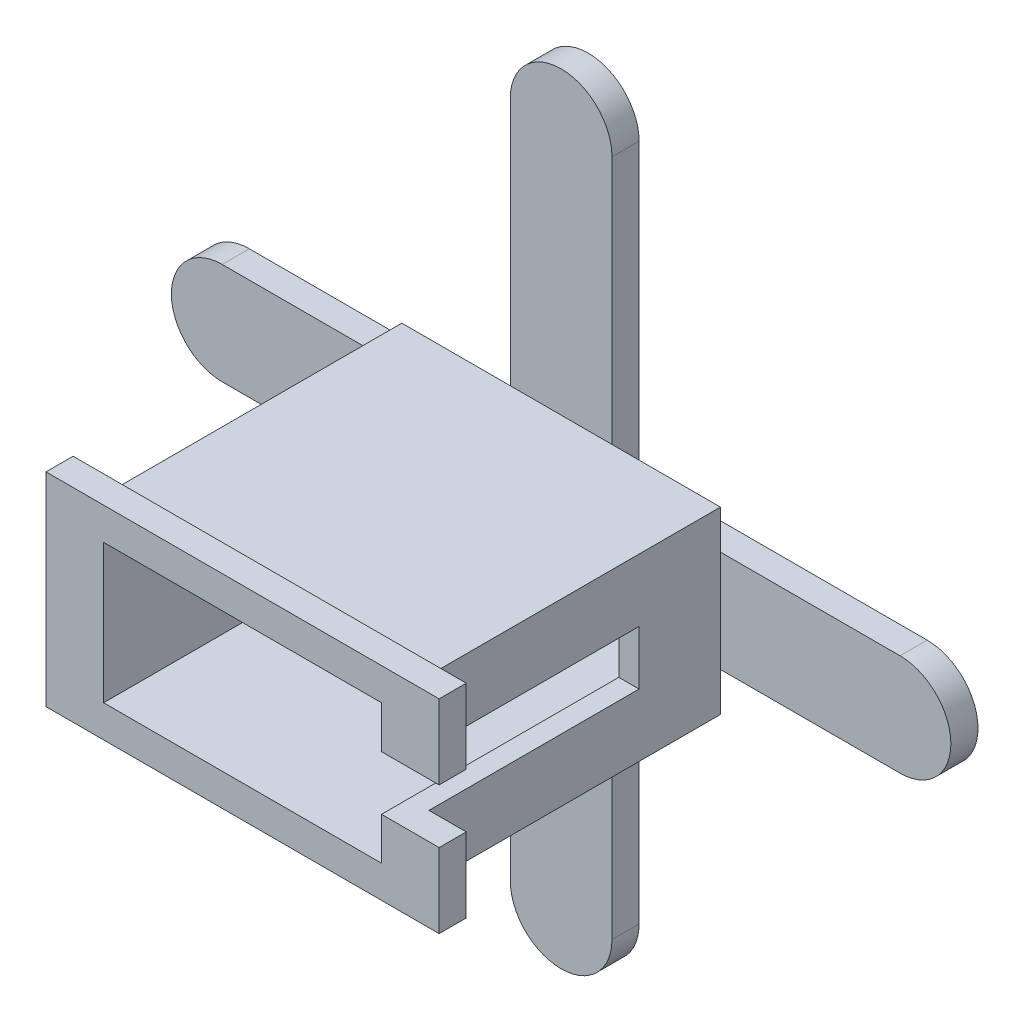
ISO-10303-21;
HEADER;
FILE_DESCRIPTION(('STEP AP214'),'2;1');
FILE_NAME('part.step','',(''),(''),'','','');
FILE_SCHEMA(('AUTOMOTIVE_DESIGN { 1 0 10303 214 1 1 1 1 }'));
ENDSEC;
DATA;
#1=APPLICATION_CONTEXT('core data for automotive mechanical design processes');
#2=APPLICATION_PROTOCOL_DEFINITION('international standard','automotive_design',2000,#1);
#3=PRODUCT_CONTEXT('',#1,'mechanical');
#4=PRODUCT('Part','Part','',(#3));
#5=PRODUCT_RELATED_PRODUCT_CATEGORY('part','',(#4));
#6=PRODUCT_DEFINITION_FORMATION('','',#4);
#7=PRODUCT_DEFINITION_CONTEXT('part definition',#1,'design');
#8=PRODUCT_DEFINITION('design','',#6,#7);
#9=PRODUCT_DEFINITION_SHAPE('','',#8);
#10=(LENGTH_UNIT() NAMED_UNIT(*) SI_UNIT(.MILLI.,.METRE.));
#11=(NAMED_UNIT(*) PLANE_ANGLE_UNIT() SI_UNIT($,.RADIAN.));
#12=(NAMED_UNIT(*) SI_UNIT($,.STERADIAN.) SOLID_ANGLE_UNIT());
#13=UNCERTAINTY_MEASURE_WITH_UNIT(LENGTH_MEASURE(1.E-05),#10,'distance_accuracy_value','');
#14=(GEOMETRIC_REPRESENTATION_CONTEXT(3) GLOBAL_UNCERTAINTY_ASSIGNED_CONTEXT((#13)) GLOBAL_UNIT_ASSIGNED_CONTEXT((#10,
#11,#12)) REPRESENTATION_CONTEXT('',''));
#15=CARTESIAN_POINT('',(0.,0.,0.));
#16=DIRECTION('',(0.,0.,1.));
#17=DIRECTION('',(1.,0.,0.));
#18=AXIS2_PLACEMENT_3D('',#15,#16,#17);
#19=CARTESIAN_POINT('',(29.,-15.,51.));
#20=DIRECTION('',(-1.,0.,0.));
#21=DIRECTION('',(0.,0.,1.));
#22=AXIS2_PLACEMENT_3D('',#19,#20,#21);
#23=PLANE('',#22);
#24=DIRECTION('',(0.,1.,0.));
#25=VECTOR('',#24,1.);
#26=CARTESIAN_POINT('',(29.,-15.,47.));
#27=LINE('',#26,#25);
#28=CARTESIAN_POINT('',(29.,-15.,47.));
#29=VERTEX_POINT('',#28);
#30=CARTESIAN_POINT('',(29.,-4.,47.));
#31=VERTEX_POINT('',#30);
#32=EDGE_CURVE('E320',#29,#31,#27,.T.);
#33=ORIENTED_EDGE('',*,*,#32,.T.);
#34=DIRECTION('',(0.,0.,1.));
#35=VECTOR('',#34,1.);
#36=CARTESIAN_POINT('',(29.,-4.,51.));
#37=LINE('',#36,#35);
#38=CARTESIAN_POINT('',(29.,-4.,51.));
#39=VERTEX_POINT('',#38);
#40=EDGE_CURVE('E47',#31,#39,#37,.T.);
#41=ORIENTED_EDGE('',*,*,#40,.T.);
#42=DIRECTION('',(0.,1.,0.));
#43=VECTOR('',#42,1.);
#44=CARTESIAN_POINT('',(29.,-15.,51.));
#45=LINE('',#44,#43);
#46=CARTESIAN_POINT('',(29.,-15.,51.));
#47=VERTEX_POINT('',#46);
#48=EDGE_CURVE('E304',#47,#39,#45,.T.);
#49=ORIENTED_EDGE('',*,*,#48,.F.);
#50=DIRECTION('',(0.,0.,-1.));
#51=VECTOR('',#50,1.);
#52=CARTESIAN_POINT('',(29.,-15.,51.));
#53=LINE('',#52,#51);
#54=EDGE_CURVE('E319',#47,#29,#53,.T.);
#55=ORIENTED_EDGE('',*,*,#54,.T.);
#56=EDGE_LOOP('',(#33,#41,#49,#55));
#57=FACE_BOUND('',#56,.T.);
#58=ADVANCED_FACE('F39',(#57),#23,.F.);
#59=CARTESIAN_POINT('',(0.,-49.9999999999997,4.));
#60=DIRECTION('',(0.,0.,1.));
#61=DIRECTION('',(1.,0.,0.));
#62=AXIS2_PLACEMENT_3D('',#59,#60,#61);
#63=PLANE('',#62);
#64=DIRECTION('',(0.,-1.,0.));
#65=VECTOR('',#64,1.);
#66=CARTESIAN_POINT('',(-7.5,-7.5,4.));
#67=LINE('',#66,#65);
#68=CARTESIAN_POINT('',(-7.5,-7.5,4.));
#69=VERTEX_POINT('',#68);
#70=CARTESIAN_POINT('',(-7.5,-10.25,4.));
#71=VERTEX_POINT('',#70);
#72=EDGE_CURVE('E457',#69,#71,#67,.T.);
#73=ORIENTED_EDGE('',*,*,#72,.T.);
#74=DIRECTION('',(1.,0.,0.));
#75=VECTOR('',#74,1.);
#76=CARTESIAN_POINT('',(-20.5,-10.25,4.));
#77=LINE('',#76,#75);
#78=CARTESIAN_POINT('',(7.5,-10.25,4.));
#79=VERTEX_POINT('',#78);
#80=EDGE_CURVE('E355',#71,#79,#77,.T.);
#81=ORIENTED_EDGE('',*,*,#80,.T.);
#82=DIRECTION('',(0.,1.,0.));
#83=VECTOR('',#82,1.);
#84=CARTESIAN_POINT('',(7.5,-7.49999999999999,4.));
#85=LINE('',#84,#83);
#86=CARTESIAN_POINT('',(7.5,-7.49999999999999,4.));
#87=VERTEX_POINT('',#86);
#88=EDGE_CURVE('E414',#79,#87,#85,.T.);
#89=ORIENTED_EDGE('',*,*,#88,.T.);
#90=DIRECTION('',(1.,0.,0.));
#91=VECTOR('',#90,1.);
#92=CARTESIAN_POINT('',(7.5,-7.49999999999999,4.));
#93=LINE('',#92,#91);
#94=CARTESIAN_POINT('',(20.5,-7.5,4.));
#95=VERTEX_POINT('',#94);
#96=EDGE_CURVE('E421',#87,#95,#93,.T.);
#97=ORIENTED_EDGE('',*,*,#96,.T.);
#98=DIRECTION('',(0.,1.,0.));
#99=VECTOR('',#98,1.);
#100=CARTESIAN_POINT('',(20.5,10.25,4.));
#101=LINE('',#100,#99);
#102=CARTESIAN_POINT('',(20.5,7.50000000000001,4.));
#103=VERTEX_POINT('',#102);
#104=EDGE_CURVE('E341',#95,#103,#101,.T.);
#105=ORIENTED_EDGE('',*,*,#104,.T.);
#106=DIRECTION('',(-1.,0.,0.));
#107=VECTOR('',#106,1.);
#108=CARTESIAN_POINT('',(7.5,7.50000000000001,4.));
#109=LINE('',#108,#107);
#110=CARTESIAN_POINT('',(7.5,7.50000000000001,4.));
#111=VERTEX_POINT('',#110);
#112=EDGE_CURVE('E427',#103,#111,#109,.T.);
#113=ORIENTED_EDGE('',*,*,#112,.T.);
#114=DIRECTION('',(0.,1.,0.));
#115=VECTOR('',#114,1.);
#116=CARTESIAN_POINT('',(7.49999999999999,50.,4.));
#117=LINE('',#116,#115);
#118=CARTESIAN_POINT('',(7.5,10.25,4.));
#119=VERTEX_POINT('',#118);
#120=EDGE_CURVE('E433',#111,#119,#117,.T.);
#121=ORIENTED_EDGE('',*,*,#120,.T.);
#122=DIRECTION('',(-1.,0.,0.));
#123=VECTOR('',#122,1.);
#124=CARTESIAN_POINT('',(-20.5,10.25,4.));
#125=LINE('',#124,#123);
#126=CARTESIAN_POINT('',(-7.5,10.25,4.));
#127=VERTEX_POINT('',#126);
#128=EDGE_CURVE('E345',#119,#127,#125,.T.);
#129=ORIENTED_EDGE('',*,*,#128,.T.);
#130=DIRECTION('',(0.,-1.,0.));
#131=VECTOR('',#130,1.);
#132=CARTESIAN_POINT('',(-7.50000000000001,50.,4.));
#133=LINE('',#132,#131);
#134=CARTESIAN_POINT('',(-7.5,7.50000000000001,4.));
#135=VERTEX_POINT('',#134);
#136=EDGE_CURVE('E439',#127,#135,#133,.T.);
#137=ORIENTED_EDGE('',*,*,#136,.T.);
#138=DIRECTION('',(-1.,0.,0.));
#139=VECTOR('',#138,1.);
#140=CARTESIAN_POINT('',(-50.,7.5,4.));
#141=LINE('',#140,#139);
#142=CARTESIAN_POINT('',(-20.5,7.50000000000001,4.));
#143=VERTEX_POINT('',#142);
#144=EDGE_CURVE('E445',#135,#143,#141,.T.);
#145=ORIENTED_EDGE('',*,*,#144,.T.);
#146=DIRECTION('',(0.,-1.,0.));
#147=VECTOR('',#146,1.);
#148=CARTESIAN_POINT('',(-20.5,10.25,4.));
#149=LINE('',#148,#147);
#150=CARTESIAN_POINT('',(-20.5,-7.5,4.));
#151=VERTEX_POINT('',#150);
#152=EDGE_CURVE('E350',#143,#151,#149,.T.);
#153=ORIENTED_EDGE('',*,*,#152,.T.);
#154=DIRECTION('',(1.,0.,0.));
#155=VECTOR('',#154,1.);
#156=CARTESIAN_POINT('',(-50.,-7.5,4.));
#157=LINE('',#156,#155);
#158=EDGE_CURVE('E451',#151,#69,#157,.T.);
#159=ORIENTED_EDGE('',*,*,#158,.T.);
#160=EDGE_LOOP('',(#73,#81,#89,#97,#105,#113,#121,#129,#137,#145,#153,#159));
#161=FACE_BOUND('',#160,.T.);
#162=ADVANCED_FACE('F584',(#161),#63,.T.);
#163=DIRECTION('',(1.,0.,0.));
#164=VECTOR('',#163,1.);
#165=CARTESIAN_POINT('',(-23.5,-13.25,4.));
#166=LINE('',#165,#164);
#167=CARTESIAN_POINT('',(-7.5,-13.25,4.));
#168=VERTEX_POINT('',#167);
#169=CARTESIAN_POINT('',(7.5,-13.25,4.));
#170=VERTEX_POINT('',#169);
#171=EDGE_CURVE('E398',#168,#170,#166,.T.);
#172=ORIENTED_EDGE('',*,*,#171,.F.);
#173=CARTESIAN_POINT('',(-7.49999999999999,-50.,4.));
#174=VERTEX_POINT('',#173);
#175=EDGE_CURVE('E455',#168,#174,#67,.T.);
#176=ORIENTED_EDGE('',*,*,#175,.T.);
#177=CARTESIAN_POINT('',(0.,-49.9999999999997,4.));
#178=DIRECTION('',(0.,0.,1.));
#179=DIRECTION('',(1.,0.,0.));
#180=AXIS2_PLACEMENT_3D('',#177,#178,#179);
#181=CIRCLE('',#180,7.5);
#182=CARTESIAN_POINT('',(7.50000000000001,-50.,4.));
#183=VERTEX_POINT('',#182);
#184=EDGE_CURVE('E411',#174,#183,#181,.T.);
#185=ORIENTED_EDGE('',*,*,#184,.T.);
#186=EDGE_CURVE('E416',#183,#170,#85,.T.);
#187=ORIENTED_EDGE('',*,*,#186,.T.);
#188=EDGE_LOOP('',(#172,#176,#185,#187));
#189=FACE_BOUND('',#188,.T.);
#190=ADVANCED_FACE('F639',(#189),#63,.T.);
#191=DIRECTION('',(0.,1.,0.));
#192=VECTOR('',#191,1.);
#193=CARTESIAN_POINT('',(23.5,-13.25,4.));
#194=LINE('',#193,#192);
#195=CARTESIAN_POINT('',(23.5,-7.49999999999999,4.));
#196=VERTEX_POINT('',#195);
#197=CARTESIAN_POINT('',(23.5,7.5,4.));
#198=VERTEX_POINT('',#197);
#199=EDGE_CURVE('E288',#196,#198,#194,.T.);
#200=ORIENTED_EDGE('',*,*,#199,.F.);
#201=CARTESIAN_POINT('',(50.,-7.5,4.));
#202=VERTEX_POINT('',#201);
#203=EDGE_CURVE('E419',#196,#202,#93,.T.);
#204=ORIENTED_EDGE('',*,*,#203,.T.);
#205=CARTESIAN_POINT('',(50.,0.,4.));
#206=DIRECTION('',(0.,0.,1.));
#207=DIRECTION('',(-1.,0.,0.));
#208=AXIS2_PLACEMENT_3D('',#205,#206,#207);
#209=CIRCLE('',#208,7.5);
#210=CARTESIAN_POINT('',(50.,7.5,4.));
#211=VERTEX_POINT('',#210);
#212=EDGE_CURVE('E424',#202,#211,#209,.T.);
#213=ORIENTED_EDGE('',*,*,#212,.T.);
#214=EDGE_CURVE('E428',#211,#198,#109,.T.);
#215=ORIENTED_EDGE('',*,*,#214,.T.);
#216=EDGE_LOOP('',(#200,#204,#213,#215));
#217=FACE_BOUND('',#216,.T.);
#218=ADVANCED_FACE('F698',(#217),#63,.T.);
#219=DIRECTION('',(-1.,0.,0.));
#220=VECTOR('',#219,1.);
#221=CARTESIAN_POINT('',(-23.5,13.25,4.));
#222=LINE('',#221,#220);
#223=CARTESIAN_POINT('',(7.5,13.25,4.));
#224=VERTEX_POINT('',#223);
#225=CARTESIAN_POINT('',(-7.5,13.25,4.));
#226=VERTEX_POINT('',#225);
#227=EDGE_CURVE('E389',#224,#226,#222,.T.);
#228=ORIENTED_EDGE('',*,*,#227,.F.);
#229=CARTESIAN_POINT('',(7.49999999999999,50.,4.));
#230=VERTEX_POINT('',#229);
#231=EDGE_CURVE('E431',#224,#230,#117,.T.);
#232=ORIENTED_EDGE('',*,*,#231,.T.);
#233=CARTESIAN_POINT('',(0.,50.,4.));
#234=DIRECTION('',(0.,0.,1.));
#235=DIRECTION('',(-1.,0.,0.));
#236=AXIS2_PLACEMENT_3D('',#233,#234,#235);
#237=CIRCLE('',#236,7.5);
#238=CARTESIAN_POINT('',(-7.50000000000001,50.,4.));
#239=VERTEX_POINT('',#238);
#240=EDGE_CURVE('E436',#230,#239,#237,.T.);
#241=ORIENTED_EDGE('',*,*,#240,.T.);
#242=EDGE_CURVE('E440',#239,#226,#133,.T.);
#243=ORIENTED_EDGE('',*,*,#242,.T.);
#244=EDGE_LOOP('',(#228,#232,#241,#243));
#245=FACE_BOUND('',#244,.T.);
#246=ADVANCED_FACE('F661',(#245),#63,.T.);
#247=CARTESIAN_POINT('',(0.,-49.9999999999997,4.));
#248=DIRECTION('',(0.,0.,-1.));
#249=DIRECTION('',(-1.,0.,0.));
#250=AXIS2_PLACEMENT_3D('',#247,#248,#249);
#251=CYLINDRICAL_SURFACE('',#250,7.5);
#252=CARTESIAN_POINT('',(0.,-49.9999999999997,0.));
#253=DIRECTION('',(0.,0.,1.));
#254=DIRECTION('',(1.,0.,0.));
#255=AXIS2_PLACEMENT_3D('',#252,#253,#254);
#256=CIRCLE('',#255,7.5);
#257=CARTESIAN_POINT('',(-7.49999999999999,-50.,0.));
#258=VERTEX_POINT('',#257);
#259=CARTESIAN_POINT('',(7.50000000000001,-50.,0.));
#260=VERTEX_POINT('',#259);
#261=EDGE_CURVE('E410',#258,#260,#256,.T.);
#262=ORIENTED_EDGE('',*,*,#261,.T.);
#263=DIRECTION('',(0.,0.,-1.));
#264=VECTOR('',#263,1.);
#265=CARTESIAN_POINT('',(7.50000000000001,-50.,4.));
#266=LINE('',#265,#264);
#267=EDGE_CURVE('E517',#183,#260,#266,.T.);
#268=ORIENTED_EDGE('',*,*,#267,.F.);
#269=ORIENTED_EDGE('',*,*,#184,.F.);
#270=DIRECTION('',(0.,0.,-1.));
#271=VECTOR('',#270,1.);
#272=CARTESIAN_POINT('',(-7.49999999999999,-50.,4.));
#273=LINE('',#272,#271);
#274=EDGE_CURVE('E460',#174,#258,#273,.T.);
#275=ORIENTED_EDGE('',*,*,#274,.T.);
#276=EDGE_LOOP('',(#262,#268,#269,#275));
#277=FACE_BOUND('',#276,.T.);
#278=ADVANCED_FACE('F41',(#277),#251,.T.);
#279=CARTESIAN_POINT('',(7.5,-7.49999999999999,4.));
#280=DIRECTION('',(-1.,0.,0.));
#281=DIRECTION('',(0.,-1.,0.));
#282=AXIS2_PLACEMENT_3D('',#279,#280,#281);
#283=PLANE('',#282);
#284=DIRECTION('',(0.,1.,0.));
#285=VECTOR('',#284,1.);
#286=CARTESIAN_POINT('',(7.5,-7.49999999999999,0.));
#287=LINE('',#286,#285);
#288=CARTESIAN_POINT('',(7.5,-7.49999999999999,0.));
#289=VERTEX_POINT('',#288);
#290=EDGE_CURVE('E464',#260,#289,#287,.T.);
#291=ORIENTED_EDGE('',*,*,#290,.T.);
#292=DIRECTION('',(0.,0.,-1.));
#293=VECTOR('',#292,1.);
#294=CARTESIAN_POINT('',(7.5,-7.49999999999999,4.));
#295=LINE('',#294,#293);
#296=EDGE_CURVE('E514',#87,#289,#295,.T.);
#297=ORIENTED_EDGE('',*,*,#296,.F.);
#298=ORIENTED_EDGE('',*,*,#88,.F.);
#299=EDGE_CURVE('E420',#170,#79,#85,.T.);
#300=ORIENTED_EDGE('',*,*,#299,.F.);
#301=ORIENTED_EDGE('',*,*,#186,.F.);
#302=ORIENTED_EDGE('',*,*,#267,.T.);
#303=EDGE_LOOP('',(#291,#297,#298,#300,#301,#302));
#304=FACE_BOUND('',#303,.T.);
#305=ADVANCED_FACE('F691',(#304),#283,.F.);
#306=CARTESIAN_POINT('',(7.5,-7.49999999999999,4.));
#307=DIRECTION('',(0.,1.,0.));
#308=DIRECTION('',(-1.,0.,0.));
#309=AXIS2_PLACEMENT_3D('',#306,#307,#308);
#310=PLANE('',#309);
#311=DIRECTION('',(1.,0.,0.));
#312=VECTOR('',#311,1.);
#313=CARTESIAN_POINT('',(7.5,-7.49999999999999,0.));
#314=LINE('',#313,#312);
#315=CARTESIAN_POINT('',(50.,-7.5,0.));
#316=VERTEX_POINT('',#315);
#317=EDGE_CURVE('E466',#289,#316,#314,.T.);
#318=ORIENTED_EDGE('',*,*,#317,.T.);
#319=DIRECTION('',(0.,0.,-1.));
#320=VECTOR('',#319,1.);
#321=CARTESIAN_POINT('',(50.,-7.5,4.));
#322=LINE('',#321,#320);
#323=EDGE_CURVE('E511',#202,#316,#322,.T.);
#324=ORIENTED_EDGE('',*,*,#323,.F.);
#325=ORIENTED_EDGE('',*,*,#203,.F.);
#326=EDGE_CURVE('E425',#95,#196,#93,.T.);
#327=ORIENTED_EDGE('',*,*,#326,.F.);
#328=ORIENTED_EDGE('',*,*,#96,.F.);
#329=ORIENTED_EDGE('',*,*,#296,.T.);
#330=EDGE_LOOP('',(#318,#324,#325,#327,#328,#329));
#331=FACE_BOUND('',#330,.T.);
#332=ADVANCED_FACE('F686',(#331),#310,.F.);
#333=CARTESIAN_POINT('',(50.,0.,4.));
#334=DIRECTION('',(0.,0.,-1.));
#335=DIRECTION('',(-1.,0.,0.));
#336=AXIS2_PLACEMENT_3D('',#333,#334,#335);
#337=CYLINDRICAL_SURFACE('',#336,7.5);
#338=CARTESIAN_POINT('',(50.,0.,0.));
#339=DIRECTION('',(0.,0.,1.));
#340=DIRECTION('',(-1.,0.,0.));
#341=AXIS2_PLACEMENT_3D('',#338,#339,#340);
#342=CIRCLE('',#341,7.5);
#343=CARTESIAN_POINT('',(50.,7.5,0.));
#344=VERTEX_POINT('',#343);
#345=EDGE_CURVE('E468',#316,#344,#342,.T.);
#346=ORIENTED_EDGE('',*,*,#345,.T.);
#347=DIRECTION('',(0.,0.,-1.));
#348=VECTOR('',#347,1.);
#349=CARTESIAN_POINT('',(50.,7.5,4.));
#350=LINE('',#349,#348);
#351=EDGE_CURVE('E508',#211,#344,#350,.T.);
#352=ORIENTED_EDGE('',*,*,#351,.F.);
#353=ORIENTED_EDGE('',*,*,#212,.F.);
#354=ORIENTED_EDGE('',*,*,#323,.T.);
#355=EDGE_LOOP('',(#346,#352,#353,#354));
#356=FACE_BOUND('',#355,.T.);
#357=ADVANCED_FACE('F682',(#356),#337,.T.);
#358=CARTESIAN_POINT('',(7.5,7.50000000000001,4.));
#359=DIRECTION('',(0.,-1.,0.));
#360=DIRECTION('',(1.,0.,0.));
#361=AXIS2_PLACEMENT_3D('',#358,#359,#360);
#362=PLANE('',#361);
#363=DIRECTION('',(-1.,0.,0.));
#364=VECTOR('',#363,1.);
#365=CARTESIAN_POINT('',(7.5,7.50000000000001,0.));
#366=LINE('',#365,#364);
#367=CARTESIAN_POINT('',(7.5,7.50000000000001,0.));
#368=VERTEX_POINT('',#367);
#369=EDGE_CURVE('E470',#344,#368,#366,.T.);
#370=ORIENTED_EDGE('',*,*,#369,.T.);
#371=DIRECTION('',(0.,0.,-1.));
#372=VECTOR('',#371,1.);
#373=CARTESIAN_POINT('',(7.5,7.50000000000001,4.));
#374=LINE('',#373,#372);
#375=EDGE_CURVE('E505',#111,#368,#374,.T.);
#376=ORIENTED_EDGE('',*,*,#375,.F.);
#377=ORIENTED_EDGE('',*,*,#112,.F.);
#378=EDGE_CURVE('E432',#198,#103,#109,.T.);
#379=ORIENTED_EDGE('',*,*,#378,.F.);
#380=ORIENTED_EDGE('',*,*,#214,.F.);
#381=ORIENTED_EDGE('',*,*,#351,.T.);
#382=EDGE_LOOP('',(#370,#376,#377,#379,#380,#381));
#383=FACE_BOUND('',#382,.T.);
#384=ADVANCED_FACE('F676',(#383),#362,.F.);
#385=CARTESIAN_POINT('',(7.49999999999999,50.,4.));
#386=DIRECTION('',(-1.,0.,0.));
#387=DIRECTION('',(0.,-1.,0.));
#388=AXIS2_PLACEMENT_3D('',#385,#386,#387);
#389=PLANE('',#388);
#390=DIRECTION('',(0.,1.,0.));
#391=VECTOR('',#390,1.);
#392=CARTESIAN_POINT('',(7.49999999999999,50.,0.));
#393=LINE('',#392,#391);
#394=CARTESIAN_POINT('',(7.49999999999999,50.,0.));
#395=VERTEX_POINT('',#394);
#396=EDGE_CURVE('E472',#368,#395,#393,.T.);
#397=ORIENTED_EDGE('',*,*,#396,.T.);
#398=DIRECTION('',(0.,0.,-1.));
#399=VECTOR('',#398,1.);
#400=CARTESIAN_POINT('',(7.49999999999999,50.,4.));
#401=LINE('',#400,#399);
#402=EDGE_CURVE('E502',#230,#395,#401,.T.);
#403=ORIENTED_EDGE('',*,*,#402,.F.);
#404=ORIENTED_EDGE('',*,*,#231,.F.);
#405=EDGE_CURVE('E437',#119,#224,#117,.T.);
#406=ORIENTED_EDGE('',*,*,#405,.F.);
#407=ORIENTED_EDGE('',*,*,#120,.F.);
#408=ORIENTED_EDGE('',*,*,#375,.T.);
#409=EDGE_LOOP('',(#397,#403,#404,#406,#407,#408));
#410=FACE_BOUND('',#409,.T.);
#411=ADVANCED_FACE('F664',(#410),#389,.F.);
#412=CARTESIAN_POINT('',(0.,50.,4.));
#413=DIRECTION('',(0.,0.,-1.));
#414=DIRECTION('',(-1.,0.,0.));
#415=AXIS2_PLACEMENT_3D('',#412,#413,#414);
#416=CYLINDRICAL_SURFACE('',#415,7.5);
#417=CARTESIAN_POINT('',(0.,50.,0.));
#418=DIRECTION('',(0.,0.,1.));
#419=DIRECTION('',(-1.,0.,0.));
#420=AXIS2_PLACEMENT_3D('',#417,#418,#419);
#421=CIRCLE('',#420,7.5);
#422=CARTESIAN_POINT('',(-7.50000000000001,50.,0.));
#423=VERTEX_POINT('',#422);
#424=EDGE_CURVE('E474',#395,#423,#421,.T.);
#425=ORIENTED_EDGE('',*,*,#424,.T.);
#426=DIRECTION('',(0.,0.,-1.));
#427=VECTOR('',#426,1.);
#428=CARTESIAN_POINT('',(-7.50000000000001,50.,4.));
#429=LINE('',#428,#427);
#430=EDGE_CURVE('E499',#239,#423,#429,.T.);
#431=ORIENTED_EDGE('',*,*,#430,.F.);
#432=ORIENTED_EDGE('',*,*,#240,.F.);
#433=ORIENTED_EDGE('',*,*,#402,.T.);
#434=EDGE_LOOP('',(#425,#431,#432,#433));
#435=FACE_BOUND('',#434,.T.);
#436=ADVANCED_FACE('F670',(#435),#416,.T.);
#437=CARTESIAN_POINT('',(-7.50000000000001,50.,4.));
#438=DIRECTION('',(1.,0.,0.));
#439=DIRECTION('',(0.,1.,0.));
#440=AXIS2_PLACEMENT_3D('',#437,#438,#439);
#441=PLANE('',#440);
#442=DIRECTION('',(0.,-1.,0.));
#443=VECTOR('',#442,1.);
#444=CARTESIAN_POINT('',(-7.50000000000001,50.,0.));
#445=LINE('',#444,#443);
#446=CARTESIAN_POINT('',(-7.5,7.50000000000001,0.));
#447=VERTEX_POINT('',#446);
#448=EDGE_CURVE('E476',#423,#447,#445,.T.);
#449=ORIENTED_EDGE('',*,*,#448,.T.);
#450=DIRECTION('',(0.,0.,-1.));
#451=VECTOR('',#450,1.);
#452=CARTESIAN_POINT('',(-7.5,7.50000000000001,4.));
#453=LINE('',#452,#451);
#454=EDGE_CURVE('E496',#135,#447,#453,.T.);
#455=ORIENTED_EDGE('',*,*,#454,.F.);
#456=ORIENTED_EDGE('',*,*,#136,.F.);
#457=EDGE_CURVE('E444',#226,#127,#133,.T.);
#458=ORIENTED_EDGE('',*,*,#457,.F.);
#459=ORIENTED_EDGE('',*,*,#242,.F.);
#460=ORIENTED_EDGE('',*,*,#430,.T.);
#461=EDGE_LOOP('',(#449,#455,#456,#458,#459,#460));
#462=FACE_BOUND('',#461,.T.);
#463=ADVANCED_FACE('F587',(#462),#441,.F.);
#464=CARTESIAN_POINT('',(-50.,7.5,4.));
#465=DIRECTION('',(0.,-1.,0.));
#466=DIRECTION('',(1.,0.,0.));
#467=AXIS2_PLACEMENT_3D('',#464,#465,#466);
#468=PLANE('',#467);
#469=DIRECTION('',(-1.,0.,0.));
#470=VECTOR('',#469,1.);
#471=CARTESIAN_POINT('',(-50.,7.5,0.));
#472=LINE('',#471,#470);
#473=CARTESIAN_POINT('',(-50.,7.5,0.));
#474=VERTEX_POINT('',#473);
#475=EDGE_CURVE('E478',#447,#474,#472,.T.);
#476=ORIENTED_EDGE('',*,*,#475,.T.);
#477=DIRECTION('',(0.,0.,-1.));
#478=VECTOR('',#477,1.);
#479=CARTESIAN_POINT('',(-50.,7.5,4.));
#480=LINE('',#479,#478);
#481=CARTESIAN_POINT('',(-50.,7.5,4.));
#482=VERTEX_POINT('',#481);
#483=EDGE_CURVE('E493',#482,#474,#480,.T.);
#484=ORIENTED_EDGE('',*,*,#483,.F.);
#485=CARTESIAN_POINT('',(-23.5,7.5,4.));
#486=VERTEX_POINT('',#485);
#487=EDGE_CURVE('E443',#486,#482,#141,.T.);
#488=ORIENTED_EDGE('',*,*,#487,.F.);
#489=EDGE_CURVE('E449',#143,#486,#141,.T.);
#490=ORIENTED_EDGE('',*,*,#489,.F.);
#491=ORIENTED_EDGE('',*,*,#144,.F.);
#492=ORIENTED_EDGE('',*,*,#454,.T.);
#493=EDGE_LOOP('',(#476,#484,#488,#490,#491,#492));
#494=FACE_BOUND('',#493,.T.);
#495=ADVANCED_FACE('F593',(#494),#468,.F.);
#496=CARTESIAN_POINT('',(-50.,0.,4.));
#497=DIRECTION('',(0.,0.,-1.));
#498=DIRECTION('',(-1.,0.,0.));
#499=AXIS2_PLACEMENT_3D('',#496,#497,#498);
#500=CYLINDRICAL_SURFACE('',#499,7.5);
#501=CARTESIAN_POINT('',(-50.,0.,0.));
#502=DIRECTION('',(0.,0.,1.));
#503=DIRECTION('',(1.,0.,0.));
#504=AXIS2_PLACEMENT_3D('',#501,#502,#503);
#505=CIRCLE('',#504,7.5);
#506=CARTESIAN_POINT('',(-50.,-7.5,0.));
#507=VERTEX_POINT('',#506);
#508=EDGE_CURVE('E480',#474,#507,#505,.T.);
#509=ORIENTED_EDGE('',*,*,#508,.T.);
#510=DIRECTION('',(0.,0.,-1.));
#511=VECTOR('',#510,1.);
#512=CARTESIAN_POINT('',(-50.,-7.5,4.));
#513=LINE('',#512,#511);
#514=CARTESIAN_POINT('',(-50.,-7.5,4.));
#515=VERTEX_POINT('',#514);
#516=EDGE_CURVE('E490',#515,#507,#513,.T.);
#517=ORIENTED_EDGE('',*,*,#516,.F.);
#518=CARTESIAN_POINT('',(-50.,0.,4.));
#519=DIRECTION('',(0.,0.,1.));
#520=DIRECTION('',(1.,0.,0.));
#521=AXIS2_PLACEMENT_3D('',#518,#519,#520);
#522=CIRCLE('',#521,7.5);
#523=EDGE_CURVE('E448',#482,#515,#522,.T.);
#524=ORIENTED_EDGE('',*,*,#523,.F.);
#525=ORIENTED_EDGE('',*,*,#483,.T.);
#526=EDGE_LOOP('',(#509,#517,#524,#525));
#527=FACE_BOUND('',#526,.T.);
#528=ADVANCED_FACE('F624',(#527),#500,.T.);
#529=CARTESIAN_POINT('',(-50.,-7.5,4.));
#530=DIRECTION('',(0.,1.,0.));
#531=DIRECTION('',(-1.,0.,0.));
#532=AXIS2_PLACEMENT_3D('',#529,#530,#531);
#533=PLANE('',#532);
#534=DIRECTION('',(1.,0.,0.));
#535=VECTOR('',#534,1.);
#536=CARTESIAN_POINT('',(-50.,-7.5,0.));
#537=LINE('',#536,#535);
#538=CARTESIAN_POINT('',(-7.5,-7.5,0.));
#539=VERTEX_POINT('',#538);
#540=EDGE_CURVE('E482',#507,#539,#537,.T.);
#541=ORIENTED_EDGE('',*,*,#540,.T.);
#542=DIRECTION('',(0.,0.,-1.));
#543=VECTOR('',#542,1.);
#544=CARTESIAN_POINT('',(-7.5,-7.5,4.));
#545=LINE('',#544,#543);
#546=EDGE_CURVE('E487',#69,#539,#545,.T.);
#547=ORIENTED_EDGE('',*,*,#546,.F.);
#548=ORIENTED_EDGE('',*,*,#158,.F.);
#549=CARTESIAN_POINT('',(-23.5,-7.5,4.));
#550=VERTEX_POINT('',#549);
#551=EDGE_CURVE('E456',#550,#151,#157,.T.);
#552=ORIENTED_EDGE('',*,*,#551,.F.);
#553=EDGE_CURVE('E452',#515,#550,#157,.T.);
#554=ORIENTED_EDGE('',*,*,#553,.F.);
#555=ORIENTED_EDGE('',*,*,#516,.T.);
#556=EDGE_LOOP('',(#541,#547,#548,#552,#554,#555));
#557=FACE_BOUND('',#556,.T.);
#558=ADVANCED_FACE('F600',(#557),#533,.F.);
#559=CARTESIAN_POINT('',(-7.5,-7.5,4.));
#560=DIRECTION('',(1.,0.,0.));
#561=DIRECTION('',(0.,1.,0.));
#562=AXIS2_PLACEMENT_3D('',#559,#560,#561);
#563=PLANE('',#562);
#564=DIRECTION('',(0.,-1.,0.));
#565=VECTOR('',#564,1.);
#566=CARTESIAN_POINT('',(-7.5,-7.5,0.));
#567=LINE('',#566,#565);
#568=EDGE_CURVE('E415',#539,#258,#567,.T.);
#569=ORIENTED_EDGE('',*,*,#568,.T.);
#570=ORIENTED_EDGE('',*,*,#274,.F.);
#571=ORIENTED_EDGE('',*,*,#175,.F.);
#572=EDGE_CURVE('E461',#71,#168,#67,.T.);
#573=ORIENTED_EDGE('',*,*,#572,.F.);
#574=ORIENTED_EDGE('',*,*,#72,.F.);
#575=ORIENTED_EDGE('',*,*,#546,.T.);
#576=EDGE_LOOP('',(#569,#570,#571,#573,#574,#575));
#577=FACE_BOUND('',#576,.T.);
#578=ADVANCED_FACE('F632',(#577),#563,.F.);
#579=DIRECTION('',(0.,-1.,0.));
#580=VECTOR('',#579,1.);
#581=CARTESIAN_POINT('',(-23.5,-13.25,4.));
#582=LINE('',#581,#580);
#583=EDGE_CURVE('E394',#486,#550,#582,.T.);
#584=ORIENTED_EDGE('',*,*,#583,.F.);
#585=ORIENTED_EDGE('',*,*,#487,.T.);
#586=ORIENTED_EDGE('',*,*,#523,.T.);
#587=ORIENTED_EDGE('',*,*,#553,.T.);
#588=EDGE_LOOP('',(#584,#585,#586,#587));
#589=FACE_BOUND('',#588,.T.);
#590=ADVANCED_FACE('F619',(#589),#63,.T.);
#591=CARTESIAN_POINT('',(0.,-49.9999999999997,0.));
#592=DIRECTION('',(0.,0.,1.));
#593=DIRECTION('',(1.,0.,0.));
#594=AXIS2_PLACEMENT_3D('',#591,#592,#593);
#595=PLANE('',#594);
#596=ORIENTED_EDGE('',*,*,#261,.F.);
#597=ORIENTED_EDGE('',*,*,#568,.F.);
#598=ORIENTED_EDGE('',*,*,#540,.F.);
#599=ORIENTED_EDGE('',*,*,#508,.F.);
#600=ORIENTED_EDGE('',*,*,#475,.F.);
#601=ORIENTED_EDGE('',*,*,#448,.F.);
#602=ORIENTED_EDGE('',*,*,#424,.F.);
#603=ORIENTED_EDGE('',*,*,#396,.F.);
#604=ORIENTED_EDGE('',*,*,#369,.F.);
#605=ORIENTED_EDGE('',*,*,#345,.F.);
#606=ORIENTED_EDGE('',*,*,#317,.F.);
#607=ORIENTED_EDGE('',*,*,#290,.F.);
#608=EDGE_LOOP('',(#596,#597,#598,#599,#600,#601,#602,#603,#604,#605,#606,#607));
#609=FACE_BOUND('',#608,.T.);
#610=ADVANCED_FACE('F629',(#609),#595,.F.);
#611=CARTESIAN_POINT('',(0.,0.,4.));
#612=DIRECTION('',(0.,0.,-1.));
#613=DIRECTION('',(-1.,0.,0.));
#614=AXIS2_PLACEMENT_3D('',#611,#612,#613);
#615=PLANE('',#614);
#616=CARTESIAN_POINT('',(23.5,-13.25,4.));
#617=VERTEX_POINT('',#616);
#618=EDGE_CURVE('E393',#170,#617,#166,.T.);
#619=ORIENTED_EDGE('',*,*,#618,.F.);
#620=ORIENTED_EDGE('',*,*,#299,.T.);
#621=CARTESIAN_POINT('',(20.5,-10.25,4.));
#622=VERTEX_POINT('',#621);
#623=EDGE_CURVE('E349',#79,#622,#77,.T.);
#624=ORIENTED_EDGE('',*,*,#623,.T.);
#625=EDGE_CURVE('E337',#622,#95,#101,.T.);
#626=ORIENTED_EDGE('',*,*,#625,.T.);
#627=ORIENTED_EDGE('',*,*,#326,.T.);
#628=EDGE_CURVE('E381',#617,#196,#194,.T.);
#629=ORIENTED_EDGE('',*,*,#628,.F.);
#630=EDGE_LOOP('',(#619,#620,#624,#626,#627,#629));
#631=FACE_BOUND('',#630,.T.);
#632=ADVANCED_FACE('F751',(#631),#615,.T.);
#633=CARTESIAN_POINT('',(23.5,13.25,4.));
#634=VERTEX_POINT('',#633);
#635=EDGE_CURVE('E366',#198,#634,#194,.T.);
#636=ORIENTED_EDGE('',*,*,#635,.F.);
#637=ORIENTED_EDGE('',*,*,#378,.T.);
#638=CARTESIAN_POINT('',(20.5,10.25,4.));
#639=VERTEX_POINT('',#638);
#640=EDGE_CURVE('E336',#103,#639,#101,.T.);
#641=ORIENTED_EDGE('',*,*,#640,.T.);
#642=EDGE_CURVE('E342',#639,#119,#125,.T.);
#643=ORIENTED_EDGE('',*,*,#642,.T.);
#644=ORIENTED_EDGE('',*,*,#405,.T.);
#645=EDGE_CURVE('E385',#634,#224,#222,.T.);
#646=ORIENTED_EDGE('',*,*,#645,.F.);
#647=EDGE_LOOP('',(#636,#637,#641,#643,#644,#646));
#648=FACE_BOUND('',#647,.T.);
#649=ADVANCED_FACE('F657',(#648),#615,.T.);
#650=CARTESIAN_POINT('',(-23.5,13.25,4.));
#651=VERTEX_POINT('',#650);
#652=EDGE_CURVE('E384',#226,#651,#222,.T.);
#653=ORIENTED_EDGE('',*,*,#652,.F.);
#654=ORIENTED_EDGE('',*,*,#457,.T.);
#655=CARTESIAN_POINT('',(-20.5,10.25,4.));
#656=VERTEX_POINT('',#655);
#657=EDGE_CURVE('E340',#127,#656,#125,.T.);
#658=ORIENTED_EDGE('',*,*,#657,.T.);
#659=EDGE_CURVE('E346',#656,#143,#149,.T.);
#660=ORIENTED_EDGE('',*,*,#659,.T.);
#661=ORIENTED_EDGE('',*,*,#489,.T.);
#662=EDGE_CURVE('E390',#651,#486,#582,.T.);
#663=ORIENTED_EDGE('',*,*,#662,.F.);
#664=EDGE_LOOP('',(#653,#654,#658,#660,#661,#663));
#665=FACE_BOUND('',#664,.T.);
#666=ADVANCED_FACE('F577',(#665),#615,.T.);
#667=CARTESIAN_POINT('',(-23.5,-13.25,4.));
#668=VERTEX_POINT('',#667);
#669=EDGE_CURVE('E388',#550,#668,#582,.T.);
#670=ORIENTED_EDGE('',*,*,#669,.F.);
#671=ORIENTED_EDGE('',*,*,#551,.T.);
#672=CARTESIAN_POINT('',(-20.5,-10.25,4.));
#673=VERTEX_POINT('',#672);
#674=EDGE_CURVE('E62',#151,#673,#149,.T.);
#675=ORIENTED_EDGE('',*,*,#674,.T.);
#676=EDGE_CURVE('E351',#673,#71,#77,.T.);
#677=ORIENTED_EDGE('',*,*,#676,.T.);
#678=ORIENTED_EDGE('',*,*,#572,.T.);
#679=EDGE_CURVE('E395',#668,#168,#166,.T.);
#680=ORIENTED_EDGE('',*,*,#679,.F.);
#681=EDGE_LOOP('',(#670,#671,#675,#677,#678,#680));
#682=FACE_BOUND('',#681,.T.);
#683=ADVANCED_FACE('F604',(#682),#615,.T.);
#684=CARTESIAN_POINT('',(23.5,-13.25,47.));
#685=DIRECTION('',(-1.,0.,0.));
#686=DIRECTION('',(0.,0.,1.));
#687=AXIS2_PLACEMENT_3D('',#684,#685,#686);
#688=PLANE('',#687);
#689=DIRECTION('',(0.,-1.,0.));
#690=VECTOR('',#689,1.);
#691=CARTESIAN_POINT('',(23.5,-13.25,16.));
#692=LINE('',#691,#690);
#693=CARTESIAN_POINT('',(23.5,4.,16.));
#694=VERTEX_POINT('',#693);
#695=CARTESIAN_POINT('',(23.5,-4.,16.));
#696=VERTEX_POINT('',#695);
#697=EDGE_CURVE('E550',#694,#696,#692,.T.);
#698=ORIENTED_EDGE('',*,*,#697,.T.);
#699=DIRECTION('',(0.,0.,1.));
#700=VECTOR('',#699,1.);
#701=CARTESIAN_POINT('',(23.5,-4.,47.));
#702=LINE('',#701,#700);
#703=CARTESIAN_POINT('',(23.5,-4.,47.));
#704=VERTEX_POINT('',#703);
#705=EDGE_CURVE('E540',#696,#704,#702,.T.);
#706=ORIENTED_EDGE('',*,*,#705,.T.);
#707=DIRECTION('',(0.,1.,0.));
#708=VECTOR('',#707,1.);
#709=CARTESIAN_POINT('',(23.5,-13.25,47.));
#710=LINE('',#709,#708);
#711=CARTESIAN_POINT('',(23.5,-13.25,47.));
#712=VERTEX_POINT('',#711);
#713=EDGE_CURVE('E367',#712,#704,#710,.T.);
#714=ORIENTED_EDGE('',*,*,#713,.F.);
#715=DIRECTION('',(0.,0.,-1.));
#716=VECTOR('',#715,1.);
#717=CARTESIAN_POINT('',(23.5,-13.25,47.));
#718=LINE('',#717,#716);
#719=EDGE_CURVE('E380',#712,#617,#718,.T.);
#720=ORIENTED_EDGE('',*,*,#719,.T.);
#721=ORIENTED_EDGE('',*,*,#628,.T.);
#722=ORIENTED_EDGE('',*,*,#199,.T.);
#723=ORIENTED_EDGE('',*,*,#635,.T.);
#724=DIRECTION('',(0.,0.,-1.));
#725=VECTOR('',#724,1.);
#726=CARTESIAN_POINT('',(23.5,13.25,47.));
#727=LINE('',#726,#725);
#728=CARTESIAN_POINT('',(23.5,13.25,47.));
#729=VERTEX_POINT('',#728);
#730=EDGE_CURVE('E407',#729,#634,#727,.T.);
#731=ORIENTED_EDGE('',*,*,#730,.F.);
#732=CARTESIAN_POINT('',(23.5,4.,47.));
#733=VERTEX_POINT('',#732);
#734=EDGE_CURVE('E371',#733,#729,#710,.T.);
#735=ORIENTED_EDGE('',*,*,#734,.F.);
#736=DIRECTION('',(0.,0.,-1.));
#737=VECTOR('',#736,1.);
#738=CARTESIAN_POINT('',(23.5,4.,47.));
#739=LINE('',#738,#737);
#740=EDGE_CURVE('E545',#733,#694,#739,.T.);
#741=ORIENTED_EDGE('',*,*,#740,.T.);
#742=EDGE_LOOP('',(#698,#706,#714,#720,#721,#722,#723,#731,#735,#741));
#743=FACE_BOUND('',#742,.T.);
#744=ADVANCED_FACE('F649',(#743),#688,.F.);
#745=CARTESIAN_POINT('',(-23.5,13.25,47.));
#746=DIRECTION('',(0.,-1.,0.));
#747=DIRECTION('',(0.,0.,-1.));
#748=AXIS2_PLACEMENT_3D('',#745,#746,#747);
#749=PLANE('',#748);
#750=ORIENTED_EDGE('',*,*,#645,.T.);
#751=ORIENTED_EDGE('',*,*,#227,.T.);
#752=ORIENTED_EDGE('',*,*,#652,.T.);
#753=DIRECTION('',(0.,0.,-1.));
#754=VECTOR('',#753,1.);
#755=CARTESIAN_POINT('',(-23.5,13.25,47.));
#756=LINE('',#755,#754);
#757=CARTESIAN_POINT('',(-23.5,13.25,47.));
#758=VERTEX_POINT('',#757);
#759=EDGE_CURVE('E404',#758,#651,#756,.T.);
#760=ORIENTED_EDGE('',*,*,#759,.F.);
#761=DIRECTION('',(-1.,0.,0.));
#762=VECTOR('',#761,1.);
#763=CARTESIAN_POINT('',(-23.5,13.25,47.));
#764=LINE('',#763,#762);
#765=EDGE_CURVE('E370',#729,#758,#764,.T.);
#766=ORIENTED_EDGE('',*,*,#765,.F.);
#767=ORIENTED_EDGE('',*,*,#730,.T.);
#768=EDGE_LOOP('',(#750,#751,#752,#760,#766,#767));
#769=FACE_BOUND('',#768,.T.);
#770=ADVANCED_FACE('F615',(#769),#749,.F.);
#771=CARTESIAN_POINT('',(-23.5,-13.25,47.));
#772=DIRECTION('',(1.,0.,0.));
#773=DIRECTION('',(0.,0.,-1.));
#774=AXIS2_PLACEMENT_3D('',#771,#772,#773);
#775=PLANE('',#774);
#776=ORIENTED_EDGE('',*,*,#662,.T.);
#777=ORIENTED_EDGE('',*,*,#583,.T.);
#778=ORIENTED_EDGE('',*,*,#669,.T.);
#779=DIRECTION('',(0.,0.,-1.));
#780=VECTOR('',#779,1.);
#781=CARTESIAN_POINT('',(-23.5,-13.25,47.));
#782=LINE('',#781,#780);
#783=CARTESIAN_POINT('',(-23.5,-13.25,47.));
#784=VERTEX_POINT('',#783);
#785=EDGE_CURVE('E401',#784,#668,#782,.T.);
#786=ORIENTED_EDGE('',*,*,#785,.F.);
#787=DIRECTION('',(0.,-1.,0.));
#788=VECTOR('',#787,1.);
#789=CARTESIAN_POINT('',(-23.5,-13.25,47.));
#790=LINE('',#789,#788);
#791=EDGE_CURVE('E374',#758,#784,#790,.T.);
#792=ORIENTED_EDGE('',*,*,#791,.F.);
#793=ORIENTED_EDGE('',*,*,#759,.T.);
#794=EDGE_LOOP('',(#776,#777,#778,#786,#792,#793));
#795=FACE_BOUND('',#794,.T.);
#796=ADVANCED_FACE('F609',(#795),#775,.F.);
#797=CARTESIAN_POINT('',(-23.5,-13.25,47.));
#798=DIRECTION('',(0.,1.,0.));
#799=DIRECTION('',(0.,0.,1.));
#800=AXIS2_PLACEMENT_3D('',#797,#798,#799);
#801=PLANE('',#800);
#802=ORIENTED_EDGE('',*,*,#679,.T.);
#803=ORIENTED_EDGE('',*,*,#171,.T.);
#804=ORIENTED_EDGE('',*,*,#618,.T.);
#805=ORIENTED_EDGE('',*,*,#719,.F.);
#806=DIRECTION('',(1.,0.,0.));
#807=VECTOR('',#806,1.);
#808=CARTESIAN_POINT('',(-23.5,-13.25,47.));
#809=LINE('',#808,#807);
#810=EDGE_CURVE('E377',#784,#712,#809,.T.);
#811=ORIENTED_EDGE('',*,*,#810,.F.);
#812=ORIENTED_EDGE('',*,*,#785,.T.);
#813=EDGE_LOOP('',(#802,#803,#804,#805,#811,#812));
#814=FACE_BOUND('',#813,.T.);
#815=ADVANCED_FACE('F642',(#814),#801,.F.);
#816=CARTESIAN_POINT('',(20.5,10.25,47.));
#817=DIRECTION('',(-1.,0.,0.));
#818=DIRECTION('',(0.,0.,1.));
#819=AXIS2_PLACEMENT_3D('',#816,#817,#818);
#820=PLANE('',#819);
#821=DIRECTION('',(0.,0.,1.));
#822=VECTOR('',#821,1.);
#823=CARTESIAN_POINT('',(20.5,-4.,47.));
#824=LINE('',#823,#822);
#825=CARTESIAN_POINT('',(20.5,-4.,16.));
#826=VERTEX_POINT('',#825);
#827=CARTESIAN_POINT('',(20.5,-4.,51.));
#828=VERTEX_POINT('',#827);
#829=EDGE_CURVE('E543',#826,#828,#824,.T.);
#830=ORIENTED_EDGE('',*,*,#829,.F.);
#831=DIRECTION('',(0.,-1.,0.));
#832=VECTOR('',#831,1.);
#833=CARTESIAN_POINT('',(20.5,10.25,16.));
#834=LINE('',#833,#832);
#835=CARTESIAN_POINT('',(20.5,4.,16.));
#836=VERTEX_POINT('',#835);
#837=EDGE_CURVE('E11',#836,#826,#834,.T.);
#838=ORIENTED_EDGE('',*,*,#837,.F.);
#839=DIRECTION('',(0.,0.,-1.));
#840=VECTOR('',#839,1.);
#841=CARTESIAN_POINT('',(20.5,4.,47.));
#842=LINE('',#841,#840);
#843=CARTESIAN_POINT('',(20.5,4.,51.));
#844=VERTEX_POINT('',#843);
#845=EDGE_CURVE('E541',#844,#836,#842,.T.);
#846=ORIENTED_EDGE('',*,*,#845,.F.);
#847=DIRECTION('',(0.,1.,0.));
#848=VECTOR('',#847,1.);
#849=CARTESIAN_POINT('',(20.5,-10.25,51.));
#850=LINE('',#849,#848);
#851=CARTESIAN_POINT('',(20.5,10.25,51.));
#852=VERTEX_POINT('',#851);
#853=EDGE_CURVE('E297',#844,#852,#850,.T.);
#854=ORIENTED_EDGE('',*,*,#853,.T.);
#855=DIRECTION('',(0.,0.,-1.));
#856=VECTOR('',#855,1.);
#857=CARTESIAN_POINT('',(20.5,10.25,47.));
#858=LINE('',#857,#856);
#859=EDGE_CURVE('E363',#852,#639,#858,.T.);
#860=ORIENTED_EDGE('',*,*,#859,.T.);
#861=ORIENTED_EDGE('',*,*,#640,.F.);
#862=ORIENTED_EDGE('',*,*,#104,.F.);
#863=ORIENTED_EDGE('',*,*,#625,.F.);
#864=DIRECTION('',(0.,0.,-1.));
#865=VECTOR('',#864,1.);
#866=CARTESIAN_POINT('',(20.5,-10.25,47.));
#867=LINE('',#866,#865);
#868=CARTESIAN_POINT('',(20.5,-10.25,51.));
#869=VERTEX_POINT('',#868);
#870=EDGE_CURVE('E354',#869,#622,#867,.T.);
#871=ORIENTED_EDGE('',*,*,#870,.F.);
#872=EDGE_CURVE('E558',#869,#828,#850,.T.);
#873=ORIENTED_EDGE('',*,*,#872,.T.);
#874=EDGE_LOOP('',(#830,#838,#846,#854,#860,#861,#862,#863,#871,#873));
#875=FACE_BOUND('',#874,.T.);
#876=ADVANCED_FACE('F563',(#875),#820,.T.);
#877=CARTESIAN_POINT('',(-20.5,10.25,47.));
#878=DIRECTION('',(0.,-1.,0.));
#879=DIRECTION('',(0.,0.,-1.));
#880=AXIS2_PLACEMENT_3D('',#877,#878,#879);
#881=PLANE('',#880);
#882=ORIENTED_EDGE('',*,*,#642,.F.);
#883=ORIENTED_EDGE('',*,*,#859,.F.);
#884=DIRECTION('',(-1.,0.,0.));
#885=VECTOR('',#884,1.);
#886=CARTESIAN_POINT('',(20.5,10.25,51.));
#887=LINE('',#886,#885);
#888=CARTESIAN_POINT('',(-20.5,10.25,51.));
#889=VERTEX_POINT('',#888);
#890=EDGE_CURVE('E312',#852,#889,#887,.T.);
#891=ORIENTED_EDGE('',*,*,#890,.T.);
#892=DIRECTION('',(0.,0.,-1.));
#893=VECTOR('',#892,1.);
#894=CARTESIAN_POINT('',(-20.5,10.25,47.));
#895=LINE('',#894,#893);
#896=EDGE_CURVE('E360',#889,#656,#895,.T.);
#897=ORIENTED_EDGE('',*,*,#896,.T.);
#898=ORIENTED_EDGE('',*,*,#657,.F.);
#899=ORIENTED_EDGE('',*,*,#128,.F.);
#900=EDGE_LOOP('',(#882,#883,#891,#897,#898,#899));
#901=FACE_BOUND('',#900,.T.);
#902=ADVANCED_FACE('F567',(#901),#881,.T.);
#903=CARTESIAN_POINT('',(-20.5,10.25,47.));
#904=DIRECTION('',(1.,0.,0.));
#905=DIRECTION('',(0.,0.,-1.));
#906=AXIS2_PLACEMENT_3D('',#903,#904,#905);
#907=PLANE('',#906);
#908=ORIENTED_EDGE('',*,*,#659,.F.);
#909=ORIENTED_EDGE('',*,*,#896,.F.);
#910=DIRECTION('',(0.,-1.,0.));
#911=VECTOR('',#910,1.);
#912=CARTESIAN_POINT('',(-20.5,10.25,51.));
#913=LINE('',#912,#911);
#914=CARTESIAN_POINT('',(-20.5,-10.25,51.));
#915=VERTEX_POINT('',#914);
#916=EDGE_CURVE('E553',#889,#915,#913,.T.);
#917=ORIENTED_EDGE('',*,*,#916,.T.);
#918=DIRECTION('',(0.,0.,-1.));
#919=VECTOR('',#918,1.);
#920=CARTESIAN_POINT('',(-20.5,-10.25,47.));
#921=LINE('',#920,#919);
#922=EDGE_CURVE('E358',#915,#673,#921,.T.);
#923=ORIENTED_EDGE('',*,*,#922,.T.);
#924=ORIENTED_EDGE('',*,*,#674,.F.);
#925=ORIENTED_EDGE('',*,*,#152,.F.);
#926=EDGE_LOOP('',(#908,#909,#917,#923,#924,#925));
#927=FACE_BOUND('',#926,.T.);
#928=ADVANCED_FACE('F571',(#927),#907,.T.);
#929=CARTESIAN_POINT('',(-20.5,-10.25,47.));
#930=DIRECTION('',(0.,1.,0.));
#931=DIRECTION('',(0.,0.,1.));
#932=AXIS2_PLACEMENT_3D('',#929,#930,#931);
#933=PLANE('',#932);
#934=ORIENTED_EDGE('',*,*,#676,.F.);
#935=ORIENTED_EDGE('',*,*,#922,.F.);
#936=DIRECTION('',(1.,0.,0.));
#937=VECTOR('',#936,1.);
#938=CARTESIAN_POINT('',(-20.5,-10.25,51.));
#939=LINE('',#938,#937);
#940=EDGE_CURVE('E556',#915,#869,#939,.T.);
#941=ORIENTED_EDGE('',*,*,#940,.T.);
#942=ORIENTED_EDGE('',*,*,#870,.T.);
#943=ORIENTED_EDGE('',*,*,#623,.F.);
#944=ORIENTED_EDGE('',*,*,#80,.F.);
#945=EDGE_LOOP('',(#934,#935,#941,#942,#943,#944));
#946=FACE_BOUND('',#945,.T.);
#947=ADVANCED_FACE('F726',(#946),#933,.T.);
#948=CARTESIAN_POINT('',(0.,0.,51.));
#949=DIRECTION('',(0.,0.,-1.));
#950=DIRECTION('',(-1.,0.,0.));
#951=AXIS2_PLACEMENT_3D('',#948,#949,#950);
#952=PLANE('',#951);
#953=ORIENTED_EDGE('',*,*,#48,.T.);
#954=DIRECTION('',(1.,0.,0.));
#955=VECTOR('',#954,1.);
#956=CARTESIAN_POINT('',(-4.43871512465036,-4.,51.));
#957=LINE('',#956,#955);
#958=EDGE_CURVE('E298',#828,#39,#957,.T.);
#959=ORIENTED_EDGE('',*,*,#958,.F.);
#960=ORIENTED_EDGE('',*,*,#872,.F.);
#961=ORIENTED_EDGE('',*,*,#940,.F.);
#962=ORIENTED_EDGE('',*,*,#916,.F.);
#963=ORIENTED_EDGE('',*,*,#890,.F.);
#964=ORIENTED_EDGE('',*,*,#853,.F.);
#965=DIRECTION('',(-1.,0.,0.));
#966=VECTOR('',#965,1.);
#967=CARTESIAN_POINT('',(-4.43871512465036,4.,51.));
#968=LINE('',#967,#966);
#969=CARTESIAN_POINT('',(29.,4.,51.));
#970=VERTEX_POINT('',#969);
#971=EDGE_CURVE('E283',#970,#844,#968,.T.);
#972=ORIENTED_EDGE('',*,*,#971,.F.);
#973=CARTESIAN_POINT('',(29.,15.,51.));
#974=VERTEX_POINT('',#973);
#975=EDGE_CURVE('E294',#970,#974,#45,.T.);
#976=ORIENTED_EDGE('',*,*,#975,.T.);
#977=DIRECTION('',(-1.,0.,0.));
#978=VECTOR('',#977,1.);
#979=CARTESIAN_POINT('',(-29.,15.,51.));
#980=LINE('',#979,#978);
#981=CARTESIAN_POINT('',(-29.,15.,51.));
#982=VERTEX_POINT('',#981);
#983=EDGE_CURVE('E307',#974,#982,#980,.T.);
#984=ORIENTED_EDGE('',*,*,#983,.T.);
#985=DIRECTION('',(0.,-1.,0.));
#986=VECTOR('',#985,1.);
#987=CARTESIAN_POINT('',(-29.,-15.,51.));
#988=LINE('',#987,#986);
#989=CARTESIAN_POINT('',(-29.,-15.,51.));
#990=VERTEX_POINT('',#989);
#991=EDGE_CURVE('E315',#982,#990,#988,.T.);
#992=ORIENTED_EDGE('',*,*,#991,.T.);
#993=DIRECTION('',(1.,0.,0.));
#994=VECTOR('',#993,1.);
#995=CARTESIAN_POINT('',(-29.,-15.,51.));
#996=LINE('',#995,#994);
#997=EDGE_CURVE('E317',#990,#47,#996,.T.);
#998=ORIENTED_EDGE('',*,*,#997,.T.);
#999=EDGE_LOOP('',(#953,#959,#960,#961,#962,#963,#964,#972,#976,#984,#992,#998));
#1000=FACE_BOUND('',#999,.T.);
#1001=ADVANCED_FACE('F293',(#1000),#952,.F.);
#1002=CARTESIAN_POINT('',(0.,0.,47.));
#1003=DIRECTION('',(0.,0.,-1.));
#1004=DIRECTION('',(-1.,0.,0.));
#1005=AXIS2_PLACEMENT_3D('',#1002,#1003,#1004);
#1006=PLANE('',#1005);
#1007=DIRECTION('',(-1.,0.,0.));
#1008=VECTOR('',#1007,1.);
#1009=CARTESIAN_POINT('',(0.,-4.,47.));
#1010=LINE('',#1009,#1008);
#1011=EDGE_CURVE('E538',#31,#704,#1010,.T.);
#1012=ORIENTED_EDGE('',*,*,#1011,.F.);
#1013=ORIENTED_EDGE('',*,*,#32,.F.);
#1014=DIRECTION('',(1.,0.,0.));
#1015=VECTOR('',#1014,1.);
#1016=CARTESIAN_POINT('',(-29.,-15.,47.));
#1017=LINE('',#1016,#1015);
#1018=CARTESIAN_POINT('',(-29.,-15.,47.));
#1019=VERTEX_POINT('',#1018);
#1020=EDGE_CURVE('E305',#1019,#29,#1017,.T.);
#1021=ORIENTED_EDGE('',*,*,#1020,.F.);
#1022=DIRECTION('',(0.,-1.,0.));
#1023=VECTOR('',#1022,1.);
#1024=CARTESIAN_POINT('',(-29.,-15.,47.));
#1025=LINE('',#1024,#1023);
#1026=CARTESIAN_POINT('',(-29.,15.,47.));
#1027=VERTEX_POINT('',#1026);
#1028=EDGE_CURVE('E308',#1027,#1019,#1025,.T.);
#1029=ORIENTED_EDGE('',*,*,#1028,.F.);
#1030=DIRECTION('',(-1.,0.,0.));
#1031=VECTOR('',#1030,1.);
#1032=CARTESIAN_POINT('',(-29.,15.,47.));
#1033=LINE('',#1032,#1031);
#1034=CARTESIAN_POINT('',(29.,15.,47.));
#1035=VERTEX_POINT('',#1034);
#1036=EDGE_CURVE('E323',#1035,#1027,#1033,.T.);
#1037=ORIENTED_EDGE('',*,*,#1036,.F.);
#1038=CARTESIAN_POINT('',(29.,4.,47.));
#1039=VERTEX_POINT('',#1038);
#1040=EDGE_CURVE('E324',#1039,#1035,#27,.T.);
#1041=ORIENTED_EDGE('',*,*,#1040,.F.);
#1042=DIRECTION('',(1.,0.,0.));
#1043=VECTOR('',#1042,1.);
#1044=CARTESIAN_POINT('',(0.,4.,47.));
#1045=LINE('',#1044,#1043);
#1046=EDGE_CURVE('E54',#733,#1039,#1045,.T.);
#1047=ORIENTED_EDGE('',*,*,#1046,.F.);
#1048=ORIENTED_EDGE('',*,*,#734,.T.);
#1049=ORIENTED_EDGE('',*,*,#765,.T.);
#1050=ORIENTED_EDGE('',*,*,#791,.T.);
#1051=ORIENTED_EDGE('',*,*,#810,.T.);
#1052=ORIENTED_EDGE('',*,*,#713,.T.);
#1053=EDGE_LOOP('',(#1012,#1013,#1021,#1029,#1037,#1041,#1047,#1048,#1049,#1050,#1051,#1052));
#1054=FACE_BOUND('',#1053,.T.);
#1055=ADVANCED_FACE('F536',(#1054),#1006,.T.);
#1056=ORIENTED_EDGE('',*,*,#975,.F.);
#1057=DIRECTION('',(0.,0.,-1.));
#1058=VECTOR('',#1057,1.);
#1059=CARTESIAN_POINT('',(29.,4.,51.));
#1060=LINE('',#1059,#1058);
#1061=EDGE_CURVE('E280',#970,#1039,#1060,.T.);
#1062=ORIENTED_EDGE('',*,*,#1061,.T.);
#1063=ORIENTED_EDGE('',*,*,#1040,.T.);
#1064=DIRECTION('',(0.,0.,-1.));
#1065=VECTOR('',#1064,1.);
#1066=CARTESIAN_POINT('',(29.,15.,51.));
#1067=LINE('',#1066,#1065);
#1068=EDGE_CURVE('E303',#974,#1035,#1067,.T.);
#1069=ORIENTED_EDGE('',*,*,#1068,.F.);
#1070=EDGE_LOOP('',(#1056,#1062,#1063,#1069));
#1071=FACE_BOUND('',#1070,.T.);
#1072=ADVANCED_FACE('F301',(#1071),#23,.F.);
#1073=CARTESIAN_POINT('',(-29.,15.,51.));
#1074=DIRECTION('',(0.,-1.,0.));
#1075=DIRECTION('',(0.,0.,-1.));
#1076=AXIS2_PLACEMENT_3D('',#1073,#1074,#1075);
#1077=PLANE('',#1076);
#1078=ORIENTED_EDGE('',*,*,#1036,.T.);
#1079=DIRECTION('',(0.,0.,-1.));
#1080=VECTOR('',#1079,1.);
#1081=CARTESIAN_POINT('',(-29.,15.,51.));
#1082=LINE('',#1081,#1080);
#1083=EDGE_CURVE('E332',#982,#1027,#1082,.T.);
#1084=ORIENTED_EDGE('',*,*,#1083,.F.);
#1085=ORIENTED_EDGE('',*,*,#983,.F.);
#1086=ORIENTED_EDGE('',*,*,#1068,.T.);
#1087=EDGE_LOOP('',(#1078,#1084,#1085,#1086));
#1088=FACE_BOUND('',#1087,.T.);
#1089=ADVANCED_FACE('F715',(#1088),#1077,.F.);
#1090=CARTESIAN_POINT('',(-29.,-15.,51.));
#1091=DIRECTION('',(1.,0.,0.));
#1092=DIRECTION('',(0.,0.,-1.));
#1093=AXIS2_PLACEMENT_3D('',#1090,#1091,#1092);
#1094=PLANE('',#1093);
#1095=ORIENTED_EDGE('',*,*,#1028,.T.);
#1096=DIRECTION('',(0.,0.,-1.));
#1097=VECTOR('',#1096,1.);
#1098=CARTESIAN_POINT('',(-29.,-15.,51.));
#1099=LINE('',#1098,#1097);
#1100=EDGE_CURVE('E329',#990,#1019,#1099,.T.);
#1101=ORIENTED_EDGE('',*,*,#1100,.F.);
#1102=ORIENTED_EDGE('',*,*,#991,.F.);
#1103=ORIENTED_EDGE('',*,*,#1083,.T.);
#1104=EDGE_LOOP('',(#1095,#1101,#1102,#1103));
#1105=FACE_BOUND('',#1104,.T.);
#1106=ADVANCED_FACE('F720',(#1105),#1094,.F.);
#1107=CARTESIAN_POINT('',(-29.,-15.,51.));
#1108=DIRECTION('',(0.,1.,0.));
#1109=DIRECTION('',(0.,0.,1.));
#1110=AXIS2_PLACEMENT_3D('',#1107,#1108,#1109);
#1111=PLANE('',#1110);
#1112=ORIENTED_EDGE('',*,*,#1020,.T.);
#1113=ORIENTED_EDGE('',*,*,#54,.F.);
#1114=ORIENTED_EDGE('',*,*,#997,.F.);
#1115=ORIENTED_EDGE('',*,*,#1100,.T.);
#1116=EDGE_LOOP('',(#1112,#1113,#1114,#1115));
#1117=FACE_BOUND('',#1116,.T.);
#1118=ADVANCED_FACE('F533',(#1117),#1111,.F.);
#1119=CARTESIAN_POINT('',(0.,0.,16.));
#1120=DIRECTION('',(0.,0.,-1.));
#1121=DIRECTION('',(-1.,0.,0.));
#1122=AXIS2_PLACEMENT_3D('',#1119,#1120,#1121);
#1123=PLANE('',#1122);
#1124=DIRECTION('',(-1.,0.,0.));
#1125=VECTOR('',#1124,1.);
#1126=CARTESIAN_POINT('',(-4.43871512465036,4.,16.));
#1127=LINE('',#1126,#1125);
#1128=EDGE_CURVE('E742',#694,#836,#1127,.T.);
#1129=ORIENTED_EDGE('',*,*,#1128,.T.);
#1130=ORIENTED_EDGE('',*,*,#837,.T.);
#1131=DIRECTION('',(1.,0.,0.));
#1132=VECTOR('',#1131,1.);
#1133=CARTESIAN_POINT('',(-4.43871512465036,-4.,16.));
#1134=LINE('',#1133,#1132);
#1135=EDGE_CURVE('E739',#826,#696,#1134,.T.);
#1136=ORIENTED_EDGE('',*,*,#1135,.T.);
#1137=ORIENTED_EDGE('',*,*,#697,.F.);
#1138=EDGE_LOOP('',(#1129,#1130,#1136,#1137));
#1139=FACE_BOUND('',#1138,.T.);
#1140=ADVANCED_FACE('F732',(#1139),#1123,.F.);
#1141=CARTESIAN_POINT('',(-4.43871512465036,-4.,16.));
#1142=DIRECTION('',(0.,-1.,0.));
#1143=DIRECTION('',(0.,0.,-1.));
#1144=AXIS2_PLACEMENT_3D('',#1141,#1142,#1143);
#1145=PLANE('',#1144);
#1146=ORIENTED_EDGE('',*,*,#829,.T.);
#1147=ORIENTED_EDGE('',*,*,#958,.T.);
#1148=ORIENTED_EDGE('',*,*,#40,.F.);
#1149=ORIENTED_EDGE('',*,*,#1011,.T.);
#1150=ORIENTED_EDGE('',*,*,#705,.F.);
#1151=ORIENTED_EDGE('',*,*,#1135,.F.);
#1152=EDGE_LOOP('',(#1146,#1147,#1148,#1149,#1150,#1151));
#1153=FACE_BOUND('',#1152,.T.);
#1154=ADVANCED_FACE('F750',(#1153),#1145,.F.);
#1155=CARTESIAN_POINT('',(-4.43871512465036,4.,16.));
#1156=DIRECTION('',(0.,1.,0.));
#1157=DIRECTION('',(0.,0.,1.));
#1158=AXIS2_PLACEMENT_3D('',#1155,#1156,#1157);
#1159=PLANE('',#1158);
#1160=ORIENTED_EDGE('',*,*,#845,.T.);
#1161=ORIENTED_EDGE('',*,*,#1128,.F.);
#1162=ORIENTED_EDGE('',*,*,#740,.F.);
#1163=ORIENTED_EDGE('',*,*,#1046,.T.);
#1164=ORIENTED_EDGE('',*,*,#1061,.F.);
#1165=ORIENTED_EDGE('',*,*,#971,.T.);
#1166=EDGE_LOOP('',(#1160,#1161,#1162,#1163,#1164,#1165));
#1167=FACE_BOUND('',#1166,.T.);
#1168=ADVANCED_FACE('F282',(#1167),#1159,.F.);
#1169=CLOSED_SHELL('',(#58,#162,#190,#218,#246,#278,#305,#332,#357,#384,#411,#436,#463,#495,
#528,#558,#578,#590,#610,#632,#649,#666,#683,#744,#770,#796,#815,#876,#902,#928,#947,#1001,
#1055,#1072,#1089,#1106,#1118,#1140,#1154,#1168));
#1170=MANIFOLD_SOLID_BREP('B2',#1169);
#1171=ADVANCED_BREP_SHAPE_REPRESENTATION('',(#18,#1170),#14);
#1172=SHAPE_DEFINITION_REPRESENTATION(#9,#1171);
ENDSEC;
END-ISO-10303-21;
